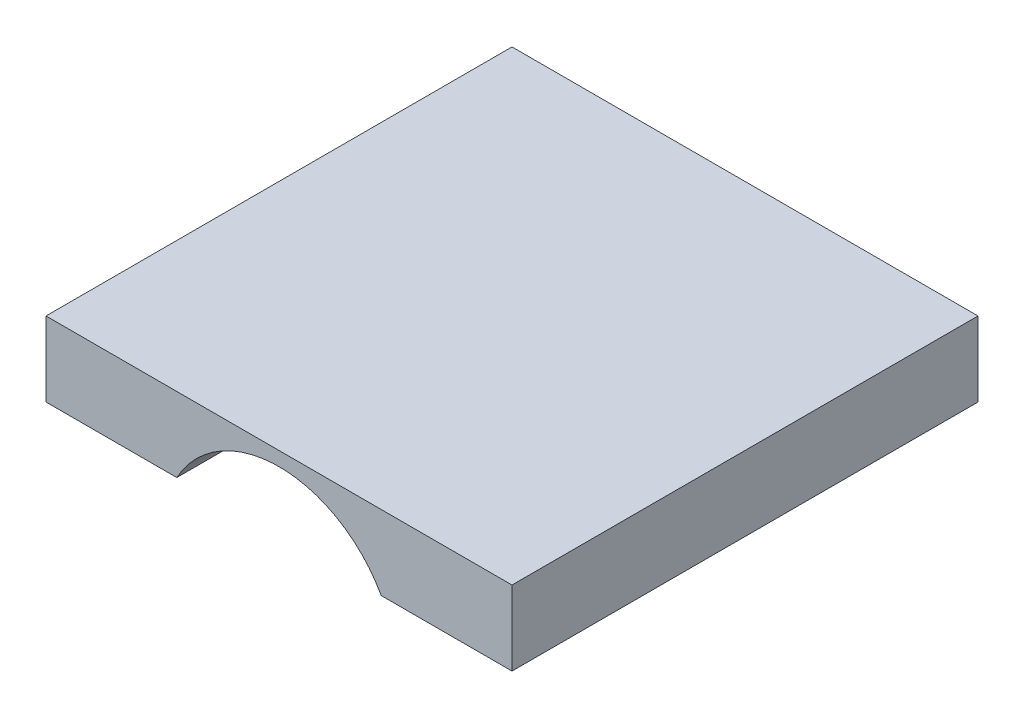
ISO-10303-21;
HEADER;
FILE_DESCRIPTION(('STEP AP214'),'2;1');
FILE_NAME('part.step','',(''),(''),'','','');
FILE_SCHEMA(('AUTOMOTIVE_DESIGN { 1 0 10303 214 1 1 1 1 }'));
ENDSEC;
DATA;
#1=APPLICATION_CONTEXT('core data for automotive mechanical design processes');
#2=APPLICATION_PROTOCOL_DEFINITION('international standard','automotive_design',2000,#1);
#3=PRODUCT_CONTEXT('',#1,'mechanical');
#4=PRODUCT('Part','Part','',(#3));
#5=PRODUCT_RELATED_PRODUCT_CATEGORY('part','',(#4));
#6=PRODUCT_DEFINITION_FORMATION('','',#4);
#7=PRODUCT_DEFINITION_CONTEXT('part definition',#1,'design');
#8=PRODUCT_DEFINITION('design','',#6,#7);
#9=PRODUCT_DEFINITION_SHAPE('','',#8);
#10=(LENGTH_UNIT() NAMED_UNIT(*) SI_UNIT(.MILLI.,.METRE.));
#11=(NAMED_UNIT(*) PLANE_ANGLE_UNIT() SI_UNIT($,.RADIAN.));
#12=(NAMED_UNIT(*) SI_UNIT($,.STERADIAN.) SOLID_ANGLE_UNIT());
#13=UNCERTAINTY_MEASURE_WITH_UNIT(LENGTH_MEASURE(1.E-05),#10,'distance_accuracy_value','');
#14=(GEOMETRIC_REPRESENTATION_CONTEXT(3) GLOBAL_UNCERTAINTY_ASSIGNED_CONTEXT((#13)) GLOBAL_UNIT_ASSIGNED_CONTEXT((#10,
#11,#12)) REPRESENTATION_CONTEXT('',''));
#15=CARTESIAN_POINT('',(0.,0.,0.));
#16=DIRECTION('',(0.,0.,1.));
#17=DIRECTION('',(1.,0.,0.));
#18=AXIS2_PLACEMENT_3D('',#15,#16,#17);
#19=CARTESIAN_POINT('',(0.,6.,0.));
#20=DIRECTION('',(0.,1.,0.));
#21=DIRECTION('',(0.,0.,1.));
#22=AXIS2_PLACEMENT_3D('',#19,#20,#21);
#23=PLANE('',#22);
#24=DIRECTION('',(-1.,0.,0.));
#25=VECTOR('',#24,1.);
#26=CARTESIAN_POINT('',(0.,6.,50.));
#27=LINE('',#26,#25);
#28=CARTESIAN_POINT('',(25.,6.,50.));
#29=VERTEX_POINT('',#28);
#30=CARTESIAN_POINT('',(10.9658560997307,6.,50.));
#31=VERTEX_POINT('',#30);
#32=EDGE_CURVE('E48',#29,#31,#27,.T.);
#33=ORIENTED_EDGE('',*,*,#32,.T.);
#34=DIRECTION('',(0.,0.,-1.));
#35=VECTOR('',#34,1.);
#36=CARTESIAN_POINT('',(10.9658560997307,6.,50.));
#37=LINE('',#36,#35);
#38=CARTESIAN_POINT('',(10.9658560997307,6.,0.));
#39=VERTEX_POINT('',#38);
#40=EDGE_CURVE('E135',#31,#39,#37,.T.);
#41=ORIENTED_EDGE('',*,*,#40,.T.);
#42=DIRECTION('',(-1.,0.,0.));
#43=VECTOR('',#42,1.);
#44=CARTESIAN_POINT('',(0.,6.,0.));
#45=LINE('',#44,#43);
#46=CARTESIAN_POINT('',(25.,6.,0.));
#47=VERTEX_POINT('',#46);
#48=EDGE_CURVE('E132',#47,#39,#45,.T.);
#49=ORIENTED_EDGE('',*,*,#48,.F.);
#50=DIRECTION('',(0.,0.,1.));
#51=VECTOR('',#50,1.);
#52=CARTESIAN_POINT('',(25.,6.,50.));
#53=LINE('',#52,#51);
#54=EDGE_CURVE('E43',#47,#29,#53,.T.);
#55=ORIENTED_EDGE('',*,*,#54,.T.);
#56=EDGE_LOOP('',(#33,#41,#49,#55));
#57=FACE_BOUND('',#56,.T.);
#58=ADVANCED_FACE('F39',(#57),#23,.F.);
#59=CARTESIAN_POINT('',(-10.9658560997307,6.,50.));
#60=VERTEX_POINT('',#59);
#61=CARTESIAN_POINT('',(-25.,6.,50.));
#62=VERTEX_POINT('',#61);
#63=EDGE_CURVE('E11',#60,#62,#27,.T.);
#64=ORIENTED_EDGE('',*,*,#63,.T.);
#65=DIRECTION('',(0.,0.,-1.));
#66=VECTOR('',#65,1.);
#67=CARTESIAN_POINT('',(-25.,6.,50.));
#68=LINE('',#67,#66);
#69=CARTESIAN_POINT('',(-25.,6.,0.));
#70=VERTEX_POINT('',#69);
#71=EDGE_CURVE('E56',#62,#70,#68,.T.);
#72=ORIENTED_EDGE('',*,*,#71,.T.);
#73=CARTESIAN_POINT('',(-10.9658560997307,6.,0.));
#74=VERTEX_POINT('',#73);
#75=EDGE_CURVE('E110',#74,#70,#45,.T.);
#76=ORIENTED_EDGE('',*,*,#75,.F.);
#77=DIRECTION('',(0.,0.,-1.));
#78=VECTOR('',#77,1.);
#79=CARTESIAN_POINT('',(-10.9658560997307,6.,50.));
#80=LINE('',#79,#78);
#81=EDGE_CURVE('E133',#74,#60,#80,.F.);
#82=ORIENTED_EDGE('',*,*,#81,.T.);
#83=EDGE_LOOP('',(#64,#72,#76,#82));
#84=FACE_BOUND('',#83,.T.);
#85=ADVANCED_FACE('F41',(#84),#23,.F.);
#86=CARTESIAN_POINT('',(0.,14.,50.));
#87=DIRECTION('',(0.,1.,0.));
#88=DIRECTION('',(0.,0.,1.));
#89=AXIS2_PLACEMENT_3D('',#86,#87,#88);
#90=PLANE('',#89);
#91=DIRECTION('',(1.,0.,0.));
#92=VECTOR('',#91,1.);
#93=CARTESIAN_POINT('',(0.,14.,0.));
#94=LINE('',#93,#92);
#95=CARTESIAN_POINT('',(-25.,14.,0.));
#96=VERTEX_POINT('',#95);
#97=CARTESIAN_POINT('',(25.,14.,0.));
#98=VERTEX_POINT('',#97);
#99=EDGE_CURVE('E109',#96,#98,#94,.T.);
#100=ORIENTED_EDGE('',*,*,#99,.F.);
#101=DIRECTION('',(0.,0.,-1.));
#102=VECTOR('',#101,1.);
#103=CARTESIAN_POINT('',(-25.,14.,50.));
#104=LINE('',#103,#102);
#105=CARTESIAN_POINT('',(-25.,14.,50.));
#106=VERTEX_POINT('',#105);
#107=EDGE_CURVE('E96',#106,#96,#104,.T.);
#108=ORIENTED_EDGE('',*,*,#107,.F.);
#109=DIRECTION('',(1.,0.,0.));
#110=VECTOR('',#109,1.);
#111=CARTESIAN_POINT('',(0.,14.,50.));
#112=LINE('',#111,#110);
#113=CARTESIAN_POINT('',(25.,14.,50.));
#114=VERTEX_POINT('',#113);
#115=EDGE_CURVE('E102',#106,#114,#112,.T.);
#116=ORIENTED_EDGE('',*,*,#115,.T.);
#117=DIRECTION('',(0.,0.,-1.));
#118=VECTOR('',#117,1.);
#119=CARTESIAN_POINT('',(25.,14.,50.));
#120=LINE('',#119,#118);
#121=EDGE_CURVE('E111',#114,#98,#120,.T.);
#122=ORIENTED_EDGE('',*,*,#121,.T.);
#123=EDGE_LOOP('',(#100,#108,#116,#122));
#124=FACE_BOUND('',#123,.T.);
#125=ADVANCED_FACE('F106',(#124),#90,.T.);
#126=CARTESIAN_POINT('',(-25.,0.,50.));
#127=DIRECTION('',(-1.,0.,0.));
#128=DIRECTION('',(0.,-1.,0.));
#129=AXIS2_PLACEMENT_3D('',#126,#127,#128);
#130=PLANE('',#129);
#131=ORIENTED_EDGE('',*,*,#71,.F.);
#132=DIRECTION('',(0.,1.,0.));
#133=VECTOR('',#132,1.);
#134=CARTESIAN_POINT('',(-25.,0.,50.));
#135=LINE('',#134,#133);
#136=EDGE_CURVE('E93',#62,#106,#135,.T.);
#137=ORIENTED_EDGE('',*,*,#136,.T.);
#138=ORIENTED_EDGE('',*,*,#107,.T.);
#139=DIRECTION('',(0.,1.,0.));
#140=VECTOR('',#139,1.);
#141=CARTESIAN_POINT('',(-25.,0.,0.));
#142=LINE('',#141,#140);
#143=EDGE_CURVE('E126',#70,#96,#142,.T.);
#144=ORIENTED_EDGE('',*,*,#143,.F.);
#145=EDGE_LOOP('',(#131,#137,#138,#144));
#146=FACE_BOUND('',#145,.T.);
#147=ADVANCED_FACE('F95',(#146),#130,.T.);
#148=CARTESIAN_POINT('',(0.,0.,50.));
#149=DIRECTION('',(0.,0.,-1.));
#150=DIRECTION('',(-1.,0.,0.));
#151=AXIS2_PLACEMENT_3D('',#148,#149,#150);
#152=CYLINDRICAL_SURFACE('',#151,12.5);
#153=ORIENTED_EDGE('',*,*,#40,.F.);
#154=CARTESIAN_POINT('',(0.,0.,50.));
#155=DIRECTION('',(0.,0.,1.));
#156=DIRECTION('',(1.,0.,0.));
#157=AXIS2_PLACEMENT_3D('',#154,#155,#156);
#158=CIRCLE('',#157,12.5);
#159=EDGE_CURVE('E122',#31,#60,#158,.T.);
#160=ORIENTED_EDGE('',*,*,#159,.T.);
#161=ORIENTED_EDGE('',*,*,#81,.F.);
#162=CARTESIAN_POINT('',(0.,0.,0.));
#163=DIRECTION('',(0.,0.,1.));
#164=DIRECTION('',(1.,0.,0.));
#165=AXIS2_PLACEMENT_3D('',#162,#163,#164);
#166=CIRCLE('',#165,12.5);
#167=EDGE_CURVE('E115',#39,#74,#166,.T.);
#168=ORIENTED_EDGE('',*,*,#167,.F.);
#169=EDGE_LOOP('',(#153,#160,#161,#168));
#170=FACE_BOUND('',#169,.T.);
#171=ADVANCED_FACE('F140',(#170),#152,.F.);
#172=CARTESIAN_POINT('',(25.,0.,50.));
#173=DIRECTION('',(1.,0.,0.));
#174=DIRECTION('',(0.,0.,-1.));
#175=AXIS2_PLACEMENT_3D('',#172,#173,#174);
#176=PLANE('',#175);
#177=ORIENTED_EDGE('',*,*,#54,.F.);
#178=DIRECTION('',(0.,-1.,0.));
#179=VECTOR('',#178,1.);
#180=CARTESIAN_POINT('',(25.,0.,0.));
#181=LINE('',#180,#179);
#182=EDGE_CURVE('E118',#98,#47,#181,.T.);
#183=ORIENTED_EDGE('',*,*,#182,.F.);
#184=ORIENTED_EDGE('',*,*,#121,.F.);
#185=DIRECTION('',(0.,-1.,0.));
#186=VECTOR('',#185,1.);
#187=CARTESIAN_POINT('',(25.,0.,50.));
#188=LINE('',#187,#186);
#189=EDGE_CURVE('E101',#114,#29,#188,.T.);
#190=ORIENTED_EDGE('',*,*,#189,.T.);
#191=EDGE_LOOP('',(#177,#183,#184,#190));
#192=FACE_BOUND('',#191,.T.);
#193=ADVANCED_FACE('F146',(#192),#176,.T.);
#194=CARTESIAN_POINT('',(0.,0.,0.));
#195=DIRECTION('',(0.,0.,1.));
#196=DIRECTION('',(1.,0.,0.));
#197=AXIS2_PLACEMENT_3D('',#194,#195,#196);
#198=PLANE('',#197);
#199=ORIENTED_EDGE('',*,*,#182,.T.);
#200=ORIENTED_EDGE('',*,*,#48,.T.);
#201=ORIENTED_EDGE('',*,*,#167,.T.);
#202=ORIENTED_EDGE('',*,*,#75,.T.);
#203=ORIENTED_EDGE('',*,*,#143,.T.);
#204=ORIENTED_EDGE('',*,*,#99,.T.);
#205=EDGE_LOOP('',(#199,#200,#201,#202,#203,#204));
#206=FACE_BOUND('',#205,.T.);
#207=ADVANCED_FACE('F143',(#206),#198,.F.);
#208=CARTESIAN_POINT('',(0.,0.,50.));
#209=DIRECTION('',(0.,0.,1.));
#210=DIRECTION('',(1.,0.,0.));
#211=AXIS2_PLACEMENT_3D('',#208,#209,#210);
#212=PLANE('',#211);
#213=ORIENTED_EDGE('',*,*,#32,.F.);
#214=ORIENTED_EDGE('',*,*,#189,.F.);
#215=ORIENTED_EDGE('',*,*,#115,.F.);
#216=ORIENTED_EDGE('',*,*,#136,.F.);
#217=ORIENTED_EDGE('',*,*,#63,.F.);
#218=ORIENTED_EDGE('',*,*,#159,.F.);
#219=EDGE_LOOP('',(#213,#214,#215,#216,#217,#218));
#220=FACE_BOUND('',#219,.T.);
#221=ADVANCED_FACE('F113',(#220),#212,.T.);
#222=CLOSED_SHELL('',(#58,#85,#125,#147,#171,#193,#207,#221));
#223=MANIFOLD_SOLID_BREP('B2',#222);
#224=ADVANCED_BREP_SHAPE_REPRESENTATION('',(#18,#223),#14);
#225=SHAPE_DEFINITION_REPRESENTATION(#9,#224);
ENDSEC;
END-ISO-10303-21;
